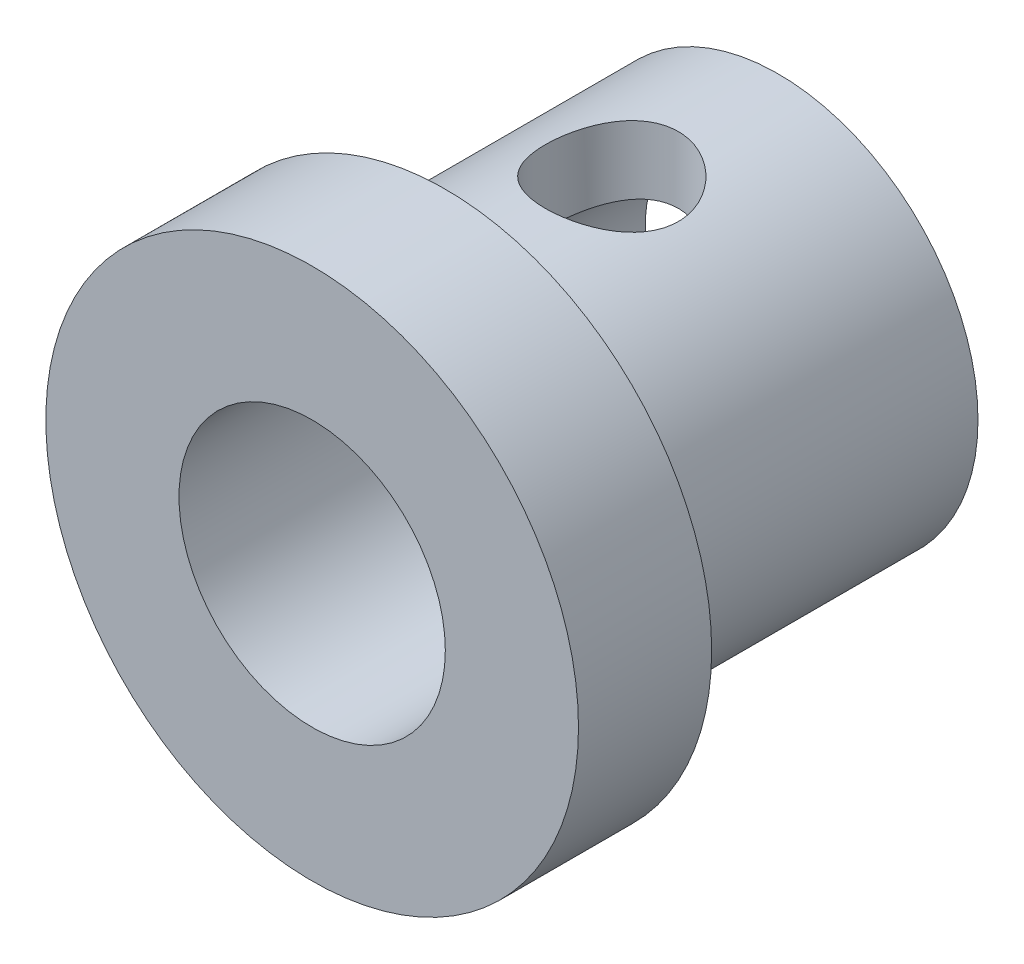
ISO-10303-21;
HEADER;
FILE_DESCRIPTION(('STEP AP214'),'2;1');
FILE_NAME('part.step','',(''),(''),'','','');
FILE_SCHEMA(('AUTOMOTIVE_DESIGN { 1 0 10303 214 1 1 1 1 }'));
ENDSEC;
DATA;
#1=APPLICATION_CONTEXT('core data for automotive mechanical design processes');
#2=APPLICATION_PROTOCOL_DEFINITION('international standard','automotive_design',2000,#1);
#3=PRODUCT_CONTEXT('',#1,'mechanical');
#4=PRODUCT('Part','Part','',(#3));
#5=PRODUCT_RELATED_PRODUCT_CATEGORY('part','',(#4));
#6=PRODUCT_DEFINITION_FORMATION('','',#4);
#7=PRODUCT_DEFINITION_CONTEXT('part definition',#1,'design');
#8=PRODUCT_DEFINITION('design','',#6,#7);
#9=PRODUCT_DEFINITION_SHAPE('','',#8);
#10=(LENGTH_UNIT() NAMED_UNIT(*) SI_UNIT(.MILLI.,.METRE.));
#11=(NAMED_UNIT(*) PLANE_ANGLE_UNIT() SI_UNIT($,.RADIAN.));
#12=(NAMED_UNIT(*) SI_UNIT($,.STERADIAN.) SOLID_ANGLE_UNIT());
#13=UNCERTAINTY_MEASURE_WITH_UNIT(LENGTH_MEASURE(1.E-05),#10,'distance_accuracy_value','');
#14=(GEOMETRIC_REPRESENTATION_CONTEXT(3) GLOBAL_UNCERTAINTY_ASSIGNED_CONTEXT((#13)) GLOBAL_UNIT_ASSIGNED_CONTEXT((#10,
#11,#12)) REPRESENTATION_CONTEXT('',''));
#15=CARTESIAN_POINT('',(0.,0.,0.));
#16=DIRECTION('',(0.,0.,1.));
#17=DIRECTION('',(1.,0.,0.));
#18=AXIS2_PLACEMENT_3D('',#15,#16,#17);
#19=CARTESIAN_POINT('',(0.,0.,4.57868852459016));
#20=DIRECTION('',(0.,0.,1.));
#21=DIRECTION('',(1.,0.,0.));
#22=AXIS2_PLACEMENT_3D('',#19,#20,#21);
#23=CYLINDRICAL_SURFACE('',#22,4.);
#24=CARTESIAN_POINT('',(0.,0.,0.));
#25=DIRECTION('',(0.,0.,1.));
#26=DIRECTION('',(1.,0.,0.));
#27=AXIS2_PLACEMENT_3D('',#24,#25,#26);
#28=CIRCLE('',#27,4.);
#29=CARTESIAN_POINT('',(4.,0.,0.));
#30=VERTEX_POINT('',#29);
#31=EDGE_CURVE('E10',#30,#30,#28,.T.);
#32=ORIENTED_EDGE('',*,*,#31,.F.);
#33=EDGE_LOOP('',(#32));
#34=FACE_BOUND('',#33,.T.);
#35=CARTESIAN_POINT('',(0.,0.,-2.));
#36=DIRECTION('',(0.,0.,1.));
#37=DIRECTION('',(1.,0.,0.));
#38=AXIS2_PLACEMENT_3D('',#35,#36,#37);
#39=CIRCLE('',#38,4.);
#40=CARTESIAN_POINT('',(4.,0.,-2.));
#41=VERTEX_POINT('',#40);
#42=EDGE_CURVE('E107',#41,#41,#39,.T.);
#43=ORIENTED_EDGE('',*,*,#42,.T.);
#44=EDGE_LOOP('',(#43));
#45=FACE_BOUND('',#44,.T.);
#46=ADVANCED_FACE('F36',(#34,#45),#23,.T.);
#47=CARTESIAN_POINT('',(0.,4.,0.));
#48=DIRECTION('',(0.,0.,-1.));
#49=DIRECTION('',(-1.,0.,0.));
#50=AXIS2_PLACEMENT_3D('',#47,#48,#49);
#51=PLANE('',#50);
#52=CARTESIAN_POINT('',(0.,0.,0.));
#53=DIRECTION('',(0.,0.,1.));
#54=DIRECTION('',(1.,0.,0.));
#55=AXIS2_PLACEMENT_3D('',#52,#53,#54);
#56=CIRCLE('',#55,2.);
#57=CARTESIAN_POINT('',(2.,0.,0.));
#58=VERTEX_POINT('',#57);
#59=EDGE_CURVE('E48',#58,#58,#56,.T.);
#60=ORIENTED_EDGE('',*,*,#59,.F.);
#61=EDGE_LOOP('',(#60));
#62=FACE_BOUND('',#61,.T.);
#63=ORIENTED_EDGE('',*,*,#31,.T.);
#64=EDGE_LOOP('',(#63));
#65=FACE_BOUND('',#64,.T.);
#66=ADVANCED_FACE('F91',(#62,#65),#51,.F.);
#67=CARTESIAN_POINT('',(0.,0.,4.57868852459016));
#68=DIRECTION('',(0.,0.,1.));
#69=DIRECTION('',(1.,0.,0.));
#70=AXIS2_PLACEMENT_3D('',#67,#68,#69);
#71=CYLINDRICAL_SURFACE('',#70,2.);
#72=CARTESIAN_POINT('',(0.,-2.,-3.5));
#73=CARTESIAN_POINT('',(-0.0525719629529865,-1.99999713404151,-3.5000033023195));
#74=CARTESIAN_POINT('',(-0.105206599698033,-1.99790491019518,-3.50417007312168));
#75=CARTESIAN_POINT('',(-0.208920235268425,-1.98974156037396,-3.52065288034092));
#76=CARTESIAN_POINT('',(-0.259996086713504,-1.98366287828984,-3.53298439299765));
#77=CARTESIAN_POINT('',(-0.358933544880574,-1.96816279403312,-3.5651938086168));
#78=CARTESIAN_POINT('',(-0.40680680293918,-1.9587543917752,-3.58504238424801));
#79=CARTESIAN_POINT('',(-0.498472616806565,-1.93745776515779,-3.63157062136494));
#80=CARTESIAN_POINT('',(-0.54226549399005,-1.9255697363353,-3.65824974424885));
#81=CARTESIAN_POINT('',(-0.627507817761919,-1.89956258258057,-3.7195172494853));
#82=CARTESIAN_POINT('',(-0.668655211122112,-1.88535199127536,-3.75448647923964));
#83=CARTESIAN_POINT('',(-0.744779444866977,-1.85659970246744,-3.83052147924703));
#84=CARTESIAN_POINT('',(-0.779751583106767,-1.84205776209035,-3.87159185177244));
#85=CARTESIAN_POINT('',(-0.845252000450278,-1.81298951197347,-3.96248334952338));
#86=CARTESIAN_POINT('',(-0.875225335551637,-1.79855186970132,-4.01273609834591));
#87=CARTESIAN_POINT('',(-0.926168226890695,-1.77285978772321,-4.11836733598621));
#88=CARTESIAN_POINT('',(-0.947144214966333,-1.7616030760699,-4.17374212872275));
#89=CARTESIAN_POINT('',(-0.978132442188588,-1.74457867037809,-4.28466510542192));
#90=CARTESIAN_POINT('',(-0.988725857080441,-1.73852271583714,-4.34000445206739));
#91=CARTESIAN_POINT('',(-1.00042699330885,-1.73181889948528,-4.45197883777948));
#92=CARTESIAN_POINT('',(-1.00154408837307,-1.73116569343288,-4.50861254087116));
#93=CARTESIAN_POINT('',(-0.994687287172294,-1.73510930257248,-4.61428602431537));
#94=CARTESIAN_POINT('',(-0.987784559536821,-1.73908763662014,-4.66342403122305));
#95=CARTESIAN_POINT('',(-0.966939849056932,-1.7507622873385,-4.75972190937304));
#96=CARTESIAN_POINT('',(-0.952995623897651,-1.75845978831776,-4.80688114530532));
#97=CARTESIAN_POINT('',(-0.918209780386004,-1.77687476412741,-4.89922913256566));
#98=CARTESIAN_POINT('',(-0.897215067115995,-1.78765840663999,-4.94434639878579));
#99=CARTESIAN_POINT('',(-0.849041687668002,-1.81103404281404,-5.03063429259001));
#100=CARTESIAN_POINT('',(-0.821860243812467,-1.82362684780191,-5.07180313560009));
#101=CARTESIAN_POINT('',(-0.758066054912788,-1.85113157903286,-5.15452125274323));
#102=CARTESIAN_POINT('',(-0.720694458369282,-1.86613510236746,-5.19545687357616));
#103=CARTESIAN_POINT('',(-0.639555578741374,-1.89547623300407,-5.2707354185909));
#104=CARTESIAN_POINT('',(-0.595785256574285,-1.90981351958801,-5.30507519203388));
#105=CARTESIAN_POINT('',(-0.500516505831848,-1.93701987282964,-5.36768566102973));
#106=CARTESIAN_POINT('',(-0.448753591599409,-1.94978984162007,-5.39560047244574));
#107=CARTESIAN_POINT('',(-0.340466215488797,-1.97157881121242,-5.44209702904301));
#108=CARTESIAN_POINT('',(-0.283945576265277,-1.98060078943553,-5.46068618501517));
#109=CARTESIAN_POINT('',(-0.172766491660702,-1.99324333741436,-5.48647540371668));
#110=CARTESIAN_POINT('',(-0.118341530548325,-1.99724938301312,-5.49449123574678));
#111=CARTESIAN_POINT('',(-0.00877959994935417,-2.00073013459102,-5.50146473113449));
#112=CARTESIAN_POINT('',(0.0463570198699009,-2.00020698721312,-5.50042668563948));
#113=CARTESIAN_POINT('',(0.151232971985993,-1.99491192253441,-5.48979331158125));
#114=CARTESIAN_POINT('',(0.201059408049954,-1.9904724568819,-5.48086746726997));
#115=CARTESIAN_POINT('',(0.298406892301917,-1.97822171314819,-5.45576192810491));
#116=CARTESIAN_POINT('',(0.345927685690996,-1.97041006334332,-5.43958143354664));
#117=CARTESIAN_POINT('',(0.438888608449665,-1.95184251413669,-5.40000153356683));
#118=CARTESIAN_POINT('',(0.484230397006154,-1.94100881769939,-5.37640894988319));
#119=CARTESIAN_POINT('',(0.570461361698921,-1.91743974317109,-5.32289246435396));
#120=CARTESIAN_POINT('',(0.611348629775282,-1.90470355565785,-5.29296586540657));
#121=CARTESIAN_POINT('',(0.691767689290652,-1.87708221337464,-5.22423957466713));
#122=CARTESIAN_POINT('',(0.730772077824638,-1.86210884848441,-5.18485713154644));
#123=CARTESIAN_POINT('',(0.801856321113239,-1.83262391603874,-5.1000748487307));
#124=CARTESIAN_POINT('',(0.833931385690841,-1.81811267381526,-5.05467088118363));
#125=CARTESIAN_POINT('',(0.891707914497696,-1.79051192226068,-4.95635634579969));
#126=CARTESIAN_POINT('',(0.917025495878637,-1.77752529663472,-4.90318873379141));
#127=CARTESIAN_POINT('',(0.958082826013803,-1.75574072368126,-4.79248993230748));
#128=CARTESIAN_POINT('',(0.97383491588757,-1.74693738240618,-4.73496447349881));
#129=CARTESIAN_POINT('',(0.993861687449679,-1.73561501008667,-4.62308977713855));
#130=CARTESIAN_POINT('',(0.999092996400865,-1.73257383460491,-4.56896574657097));
#131=CARTESIAN_POINT('',(1.00068915438079,-1.73165354646175,-4.46055293282927));
#132=CARTESIAN_POINT('',(0.997057846624399,-1.73377219627553,-4.40626423126057));
#133=CARTESIAN_POINT('',(0.981926125592263,-1.74237862050025,-4.30451649846799));
#134=CARTESIAN_POINT('',(0.9712083143428,-1.74843094482394,-4.2568995298556));
#135=CARTESIAN_POINT('',(0.943175358224645,-1.76371016187918,-4.16419188057529));
#136=CARTESIAN_POINT('',(0.92585809115981,-1.77293807569676,-4.11910201790803));
#137=CARTESIAN_POINT('',(0.883815745300683,-1.79428530364528,-4.02937514901339));
#138=CARTESIAN_POINT('',(0.858671137816458,-1.80655722396191,-3.9849720981703));
#139=CARTESIAN_POINT('',(0.802150971636634,-1.8323533163459,-3.90072546381941));
#140=CARTESIAN_POINT('',(0.770772171238648,-1.84587813794522,-3.86088426948151));
#141=CARTESIAN_POINT('',(0.698203326664641,-1.87462323159313,-3.78185801764239));
#142=CARTESIAN_POINT('',(0.656284423010171,-1.88984983311469,-3.74334089763808));
#143=CARTESIAN_POINT('',(0.56615480622028,-1.91877752255088,-3.67373701657637));
#144=CARTESIAN_POINT('',(0.517940723256785,-1.9324777860804,-3.64265426057371));
#145=CARTESIAN_POINT('',(0.415931596819947,-1.95698009585103,-3.5887636372378));
#146=CARTESIAN_POINT('',(0.362099503934614,-1.96776096562909,-3.56601583058857));
#147=CARTESIAN_POINT('',(0.250742101294191,-1.98501341363465,-3.53019183208105));
#148=CARTESIAN_POINT('',(0.193227799623166,-1.99149723372932,-3.51708815317042));
#149=CARTESIAN_POINT('',(0.112601946483384,-1.99695461909663,-3.50610258892415));
#150=CARTESIAN_POINT('',(0.090161879439499,-1.99809365339202,-3.50381735913638));
#151=CARTESIAN_POINT('',(0.0451517318071578,-1.99961696977865,-3.50076533448319));
#152=CARTESIAN_POINT('',(0.0225816476473815,-2.00000123103763,-3.4999985815288));
#153=CARTESIAN_POINT('',(0.,-2.,-3.5));
#154=B_SPLINE_CURVE_WITH_KNOTS('',3,(#72,#73,#74,#75,#76,#77,#78,#79,#80,#81,#82,#83,#84,#85,
#86,#87,#88,#89,#90,#91,#92,#93,#94,#95,#96,#97,#98,#99,#100,#101,#102,#103,#104,#105,#106,#107,
#108,#109,#110,#111,#112,#113,#114,#115,#116,#117,#118,#119,#120,#121,#122,#123,#124,#125,#126,
#127,#128,#129,#130,#131,#132,#133,#134,#135,#136,#137,#138,#139,#140,#141,#142,#143,#144,#145,
#146,#147,#148,#149,#150,#151,#152,#153),.UNSPECIFIED.,.T.,.F.,(4,2,2,2,2,2,2,2,2,2,2,2,2,2,2,2,
2,2,2,2,2,2,2,2,2,2,2,2,2,2,2,2,2,2,2,2,2,2,2,2,4),(0.,0.157624257420292,0.315548149709198,
0.472862155492298,0.630163760581568,0.796981758718089,0.963926237654035,1.14381726430753,
1.32357947898281,1.49258012140229,1.6614135732902,1.81005712409321,1.95874803925678,
2.11090240168487,2.26312521260222,2.43464941333878,2.60625534598686,2.78583022214441,
2.96526216912279,3.12983290471346,3.29432564511476,3.44606906506122,3.59782921630931,
3.75392856027899,3.91009450748339,4.08159610644419,4.25321588615432,4.43314682159674,
4.61284511940778,4.77529307498373,4.93767059860005,5.08457930244183,5.23153528783678,
5.38836456775614,5.54527561138958,5.72125242752498,5.89732383376572,6.07464013662925,
6.2514490862493,6.31915280137697,6.38685838514847),.UNSPECIFIED.);
#155=CARTESIAN_POINT('',(0.,-2.,-3.5));
#156=VERTEX_POINT('',#155);
#157=EDGE_CURVE('E82',#156,#156,#154,.T.);
#158=ORIENTED_EDGE('',*,*,#157,.T.);
#159=EDGE_LOOP('',(#158));
#160=FACE_BOUND('',#159,.T.);
#161=CARTESIAN_POINT('',(0.,2.,-3.5));
#162=CARTESIAN_POINT('',(0.0525719629529865,1.99999713404151,-3.5000033023195));
#163=CARTESIAN_POINT('',(0.105206599698033,1.99790491019518,-3.50417007312168));
#164=CARTESIAN_POINT('',(0.208920235268425,1.98974156037396,-3.52065288034092));
#165=CARTESIAN_POINT('',(0.259996086713504,1.98366287828984,-3.53298439299765));
#166=CARTESIAN_POINT('',(0.358933544880574,1.96816279403312,-3.5651938086168));
#167=CARTESIAN_POINT('',(0.40680680293918,1.9587543917752,-3.58504238424801));
#168=CARTESIAN_POINT('',(0.498472616806565,1.93745776515779,-3.63157062136494));
#169=CARTESIAN_POINT('',(0.54226549399005,1.9255697363353,-3.65824974424885));
#170=CARTESIAN_POINT('',(0.627507817761919,1.89956258258057,-3.7195172494853));
#171=CARTESIAN_POINT('',(0.668655211122112,1.88535199127536,-3.75448647923964));
#172=CARTESIAN_POINT('',(0.744779444866977,1.85659970246744,-3.83052147924703));
#173=CARTESIAN_POINT('',(0.779751583106767,1.84205776209035,-3.87159185177244));
#174=CARTESIAN_POINT('',(0.845252000450278,1.81298951197347,-3.96248334952338));
#175=CARTESIAN_POINT('',(0.875225335551637,1.79855186970132,-4.01273609834591));
#176=CARTESIAN_POINT('',(0.926168226890695,1.77285978772321,-4.11836733598621));
#177=CARTESIAN_POINT('',(0.947144214966333,1.7616030760699,-4.17374212872275));
#178=CARTESIAN_POINT('',(0.978132442188588,1.74457867037809,-4.28466510542192));
#179=CARTESIAN_POINT('',(0.988725857080441,1.73852271583714,-4.34000445206739));
#180=CARTESIAN_POINT('',(1.00042699330885,1.73181889948528,-4.45197883777948));
#181=CARTESIAN_POINT('',(1.00154408837307,1.73116569343288,-4.50861254087116));
#182=CARTESIAN_POINT('',(0.994687287172294,1.73510930257248,-4.61428602431537));
#183=CARTESIAN_POINT('',(0.987784559536821,1.73908763662014,-4.66342403122305));
#184=CARTESIAN_POINT('',(0.966939849056932,1.7507622873385,-4.75972190937304));
#185=CARTESIAN_POINT('',(0.952995623897651,1.75845978831776,-4.80688114530532));
#186=CARTESIAN_POINT('',(0.918209780386004,1.77687476412741,-4.89922913256566));
#187=CARTESIAN_POINT('',(0.897215067115995,1.78765840663999,-4.94434639878579));
#188=CARTESIAN_POINT('',(0.849041687668002,1.81103404281404,-5.03063429259001));
#189=CARTESIAN_POINT('',(0.821860243812467,1.82362684780191,-5.07180313560009));
#190=CARTESIAN_POINT('',(0.758066054912788,1.85113157903286,-5.15452125274323));
#191=CARTESIAN_POINT('',(0.720694458369282,1.86613510236746,-5.19545687357616));
#192=CARTESIAN_POINT('',(0.639555578741374,1.89547623300407,-5.2707354185909));
#193=CARTESIAN_POINT('',(0.595785256574285,1.90981351958801,-5.30507519203388));
#194=CARTESIAN_POINT('',(0.500516505831848,1.93701987282964,-5.36768566102973));
#195=CARTESIAN_POINT('',(0.448753591599409,1.94978984162007,-5.39560047244574));
#196=CARTESIAN_POINT('',(0.340466215488797,1.97157881121242,-5.44209702904301));
#197=CARTESIAN_POINT('',(0.283945576265277,1.98060078943553,-5.46068618501517));
#198=CARTESIAN_POINT('',(0.172766491660702,1.99324333741436,-5.48647540371668));
#199=CARTESIAN_POINT('',(0.118341530548325,1.99724938301312,-5.49449123574678));
#200=CARTESIAN_POINT('',(0.00877959994935417,2.00073013459102,-5.50146473113449));
#201=CARTESIAN_POINT('',(-0.0463570198699009,2.00020698721312,-5.50042668563948));
#202=CARTESIAN_POINT('',(-0.151232971985993,1.99491192253441,-5.48979331158125));
#203=CARTESIAN_POINT('',(-0.201059408049954,1.9904724568819,-5.48086746726997));
#204=CARTESIAN_POINT('',(-0.298406892301917,1.97822171314819,-5.45576192810491));
#205=CARTESIAN_POINT('',(-0.345927685690996,1.97041006334332,-5.43958143354664));
#206=CARTESIAN_POINT('',(-0.438888608449665,1.95184251413669,-5.40000153356683));
#207=CARTESIAN_POINT('',(-0.484230397006154,1.94100881769939,-5.37640894988319));
#208=CARTESIAN_POINT('',(-0.570461361698921,1.91743974317109,-5.32289246435396));
#209=CARTESIAN_POINT('',(-0.611348629775282,1.90470355565785,-5.29296586540657));
#210=CARTESIAN_POINT('',(-0.691767689290652,1.87708221337464,-5.22423957466713));
#211=CARTESIAN_POINT('',(-0.730772077824638,1.86210884848441,-5.18485713154644));
#212=CARTESIAN_POINT('',(-0.801856321113239,1.83262391603874,-5.1000748487307));
#213=CARTESIAN_POINT('',(-0.833931385690841,1.81811267381526,-5.05467088118363));
#214=CARTESIAN_POINT('',(-0.891707914497696,1.79051192226068,-4.95635634579969));
#215=CARTESIAN_POINT('',(-0.917025495878637,1.77752529663472,-4.90318873379141));
#216=CARTESIAN_POINT('',(-0.958082826013803,1.75574072368126,-4.79248993230748));
#217=CARTESIAN_POINT('',(-0.97383491588757,1.74693738240618,-4.73496447349881));
#218=CARTESIAN_POINT('',(-0.993861687449679,1.73561501008667,-4.62308977713855));
#219=CARTESIAN_POINT('',(-0.999092996400865,1.73257383460491,-4.56896574657097));
#220=CARTESIAN_POINT('',(-1.00068915438079,1.73165354646175,-4.46055293282927));
#221=CARTESIAN_POINT('',(-0.997057846624399,1.73377219627553,-4.40626423126057));
#222=CARTESIAN_POINT('',(-0.981926125592263,1.74237862050025,-4.30451649846799));
#223=CARTESIAN_POINT('',(-0.9712083143428,1.74843094482394,-4.2568995298556));
#224=CARTESIAN_POINT('',(-0.943175358224645,1.76371016187918,-4.16419188057529));
#225=CARTESIAN_POINT('',(-0.92585809115981,1.77293807569676,-4.11910201790803));
#226=CARTESIAN_POINT('',(-0.883815745300683,1.79428530364528,-4.02937514901339));
#227=CARTESIAN_POINT('',(-0.858671137816458,1.80655722396191,-3.9849720981703));
#228=CARTESIAN_POINT('',(-0.802150971636634,1.8323533163459,-3.90072546381941));
#229=CARTESIAN_POINT('',(-0.770772171238648,1.84587813794522,-3.86088426948151));
#230=CARTESIAN_POINT('',(-0.698203326664641,1.87462323159313,-3.78185801764239));
#231=CARTESIAN_POINT('',(-0.656284423010171,1.88984983311469,-3.74334089763808));
#232=CARTESIAN_POINT('',(-0.56615480622028,1.91877752255088,-3.67373701657637));
#233=CARTESIAN_POINT('',(-0.517940723256785,1.9324777860804,-3.64265426057371));
#234=CARTESIAN_POINT('',(-0.415931596819947,1.95698009585103,-3.5887636372378));
#235=CARTESIAN_POINT('',(-0.362099503934614,1.96776096562909,-3.56601583058857));
#236=CARTESIAN_POINT('',(-0.250742101294191,1.98501341363465,-3.53019183208105));
#237=CARTESIAN_POINT('',(-0.193227799623166,1.99149723372932,-3.51708815317042));
#238=CARTESIAN_POINT('',(-0.112601946483384,1.99695461909663,-3.50610258892415));
#239=CARTESIAN_POINT('',(-0.090161879439499,1.99809365339202,-3.50381735913638));
#240=CARTESIAN_POINT('',(-0.0451517318071578,1.99961696977865,-3.50076533448319));
#241=CARTESIAN_POINT('',(-0.0225816476473815,2.00000123103763,-3.4999985815288));
#242=CARTESIAN_POINT('',(0.,2.,-3.5));
#243=B_SPLINE_CURVE_WITH_KNOTS('',3,(#161,#162,#163,#164,#165,#166,#167,#168,#169,#170,#171,
#172,#173,#174,#175,#176,#177,#178,#179,#180,#181,#182,#183,#184,#185,#186,#187,#188,#189,#190,
#191,#192,#193,#194,#195,#196,#197,#198,#199,#200,#201,#202,#203,#204,#205,#206,#207,#208,#209,
#210,#211,#212,#213,#214,#215,#216,#217,#218,#219,#220,#221,#222,#223,#224,#225,#226,#227,#228,
#229,#230,#231,#232,#233,#234,#235,#236,#237,#238,#239,#240,#241,#242),.UNSPECIFIED.,.T.,.F.,(4,
2,2,2,2,2,2,2,2,2,2,2,2,2,2,2,2,2,2,2,2,2,2,2,2,2,2,2,2,2,2,2,2,2,2,2,2,2,2,2,4),(0.,
0.157624257420292,0.315548149709198,0.472862155492298,0.630163760581568,0.796981758718089,
0.963926237654035,1.14381726430753,1.32357947898281,1.49258012140229,1.6614135732902,
1.81005712409321,1.95874803925678,2.11090240168487,2.26312521260222,2.43464941333878,
2.60625534598686,2.78583022214441,2.96526216912279,3.12983290471346,3.29432564511476,
3.44606906506122,3.59782921630931,3.75392856027899,3.91009450748339,4.08159610644419,
4.25321588615432,4.43314682159674,4.61284511940778,4.77529307498373,4.93767059860005,
5.08457930244183,5.23153528783678,5.38836456775614,5.54527561138958,5.72125242752498,
5.89732383376572,6.07464013662925,6.2514490862493,6.31915280137697,6.38685838514847),.UNSPECIFIED.);
#244=CARTESIAN_POINT('',(0.,2.,-3.5));
#245=VERTEX_POINT('',#244);
#246=EDGE_CURVE('E76',#245,#245,#243,.T.);
#247=ORIENTED_EDGE('',*,*,#246,.T.);
#248=EDGE_LOOP('',(#247));
#249=FACE_BOUND('',#248,.T.);
#250=CARTESIAN_POINT('',(0.,0.,-7.));
#251=DIRECTION('',(0.,0.,1.));
#252=DIRECTION('',(1.,0.,0.));
#253=AXIS2_PLACEMENT_3D('',#250,#251,#252);
#254=CIRCLE('',#253,2.);
#255=CARTESIAN_POINT('',(2.,0.,-7.));
#256=VERTEX_POINT('',#255);
#257=EDGE_CURVE('E53',#256,#256,#254,.T.);
#258=ORIENTED_EDGE('',*,*,#257,.F.);
#259=EDGE_LOOP('',(#258));
#260=FACE_BOUND('',#259,.T.);
#261=ORIENTED_EDGE('',*,*,#59,.T.);
#262=EDGE_LOOP('',(#261));
#263=FACE_BOUND('',#262,.T.);
#264=ADVANCED_FACE('F87',(#160,#249,#260,#263),#71,.F.);
#265=CARTESIAN_POINT('',(0.,2.,-7.));
#266=DIRECTION('',(0.,0.,1.));
#267=DIRECTION('',(1.,0.,0.));
#268=AXIS2_PLACEMENT_3D('',#265,#266,#267);
#269=PLANE('',#268);
#270=CARTESIAN_POINT('',(0.,0.,-7.));
#271=DIRECTION('',(0.,0.,1.));
#272=DIRECTION('',(1.,0.,0.));
#273=AXIS2_PLACEMENT_3D('',#270,#271,#272);
#274=CIRCLE('',#273,3.);
#275=CARTESIAN_POINT('',(3.,0.,-7.));
#276=VERTEX_POINT('',#275);
#277=EDGE_CURVE('E111',#276,#276,#274,.T.);
#278=ORIENTED_EDGE('',*,*,#277,.F.);
#279=EDGE_LOOP('',(#278));
#280=FACE_BOUND('',#279,.T.);
#281=ORIENTED_EDGE('',*,*,#257,.T.);
#282=EDGE_LOOP('',(#281));
#283=FACE_BOUND('',#282,.T.);
#284=ADVANCED_FACE('F90',(#280,#283),#269,.F.);
#285=CARTESIAN_POINT('',(0.,0.,4.57868852459016));
#286=DIRECTION('',(0.,0.,1.));
#287=DIRECTION('',(1.,0.,0.));
#288=AXIS2_PLACEMENT_3D('',#285,#286,#287);
#289=CYLINDRICAL_SURFACE('',#288,3.);
#290=CARTESIAN_POINT('',(0.,-3.,-3.5));
#291=CARTESIAN_POINT('',(0.0545633628867232,-3.00000015300943,-3.49999974626836));
#292=CARTESIAN_POINT('',(0.10912519453855,-2.99849769507545,-3.50448026612722));
#293=CARTESIAN_POINT('',(0.216641760872972,-2.99265210203281,-3.52222910881722));
#294=CARTESIAN_POINT('',(0.269596328118818,-2.98830867202153,-3.53549834394892));
#295=CARTESIAN_POINT('',(0.372332789501776,-2.97725307906443,-3.57031924338405));
#296=CARTESIAN_POINT('',(0.422119825886034,-2.97054487730853,-3.59185706245927));
#297=CARTESIAN_POINT('',(0.517374936805324,-2.95544445717342,-3.64254117283835));
#298=CARTESIAN_POINT('',(0.562842156958705,-2.94705190667778,-3.6716889650026));
#299=CARTESIAN_POINT('',(0.649741675022266,-2.92914094443005,-3.73782580485875));
#300=CARTESIAN_POINT('',(0.691003700298309,-2.91959556463785,-3.77503123426049));
#301=CARTESIAN_POINT('',(0.766832692702084,-2.90060314783121,-3.85576715470657));
#302=CARTESIAN_POINT('',(0.801398185489462,-2.89115613290549,-3.89929903492851));
#303=CARTESIAN_POINT('',(0.863824942227859,-2.87313332477274,-3.99298511519646));
#304=CARTESIAN_POINT('',(0.891464858221032,-2.86459039275688,-4.04329373973212));
#305=CARTESIAN_POINT('',(0.937818873877721,-2.84975305418601,-4.14817609445855));
#306=CARTESIAN_POINT('',(0.956535697386765,-2.84345796160746,-4.20274851716274));
#307=CARTESIAN_POINT('',(0.983873461509163,-2.83411303269377,-4.31267322149671));
#308=CARTESIAN_POINT('',(0.992813448271769,-2.83096095769611,-4.36793720848907));
#309=CARTESIAN_POINT('',(1.00134112333448,-2.82795656629508,-4.47926375415588));
#310=CARTESIAN_POINT('',(1.00093170160472,-2.8281032302273,-4.53532606070919));
#311=CARTESIAN_POINT('',(0.991019903703419,-2.8315901500818,-4.64393663044402));
#312=CARTESIAN_POINT('',(0.981933913166995,-2.83478415867533,-4.69652840291902));
#313=CARTESIAN_POINT('',(0.955606162849417,-2.84376657724551,-4.79939341960683));
#314=CARTESIAN_POINT('',(0.938363426591871,-2.84955529784108,-4.84966638543507));
#315=CARTESIAN_POINT('',(0.895939058060211,-2.86317911131249,-4.94741274959148));
#316=CARTESIAN_POINT('',(0.870634048707263,-2.87104565793117,-4.99482802546953));
#317=CARTESIAN_POINT('',(0.812889106303139,-2.88792558575726,-5.08487090827973));
#318=CARTESIAN_POINT('',(0.780447112364006,-2.89693929790464,-5.12749712693338));
#319=CARTESIAN_POINT('',(0.707349332682238,-2.91567329167741,-5.20909159816077));
#320=CARTESIAN_POINT('',(0.666353150076311,-2.92540589354843,-5.24775269450907));
#321=CARTESIAN_POINT('',(0.578339569970064,-2.94406938387037,-5.3177312666634));
#322=CARTESIAN_POINT('',(0.531321595660815,-2.95300019538067,-5.3490480381645));
#323=CARTESIAN_POINT('',(0.431947613046268,-2.96917107937794,-5.40369630023507));
#324=CARTESIAN_POINT('',(0.379543276416337,-2.97639350008039,-5.42694549134073));
#325=CARTESIAN_POINT('',(0.271269083364508,-2.98820567144435,-5.46420317395571));
#326=CARTESIAN_POINT('',(0.215400438154954,-2.99279633654878,-5.47821487542344));
#327=CARTESIAN_POINT('',(0.104383829529304,-2.99867627071441,-5.49605566602236));
#328=CARTESIAN_POINT('',(0.0493095998648452,-3.00010001833731,-5.50029980917275));
#329=CARTESIAN_POINT('',(-0.0607750699602365,-2.99988902694825,-5.49966732640153));
#330=CARTESIAN_POINT('',(-0.115785519319647,-2.99825480419352,-5.49479224002013));
#331=CARTESIAN_POINT('',(-0.222519866304259,-2.99220024717114,-5.47638809226403));
#332=CARTESIAN_POINT('',(-0.274292806834856,-2.98786198711228,-5.46311379395048));
#333=CARTESIAN_POINT('',(-0.374855958579561,-2.97691846830034,-5.4286065555333));
#334=CARTESIAN_POINT('',(-0.423645788508559,-2.97031292046541,-5.40737260053233));
#335=CARTESIAN_POINT('',(-0.518288296393321,-2.95528931287427,-5.3569295681591));
#336=CARTESIAN_POINT('',(-0.564029959217329,-2.94682814756305,-5.3275254067164));
#337=CARTESIAN_POINT('',(-0.650064830135403,-2.92905253915743,-5.26180584998695));
#338=CARTESIAN_POINT('',(-0.690356367794893,-2.91973783591888,-5.22548834396984));
#339=CARTESIAN_POINT('',(-0.766252507807013,-2.90076847982472,-5.14502124899174));
#340=CARTESIAN_POINT('',(-0.801560969248491,-2.89111761095155,-5.10059077306675));
#341=CARTESIAN_POINT('',(-0.864257522320854,-2.87299973286981,-5.0062284321955));
#342=CARTESIAN_POINT('',(-0.891645547920843,-2.8645327335312,-4.9562965213898));
#343=CARTESIAN_POINT('',(-0.937596930423361,-2.84982391820308,-4.85232698469341));
#344=CARTESIAN_POINT('',(-0.956178132197766,-2.84357760900632,-4.79829792075722));
#345=CARTESIAN_POINT('',(-0.983894666792163,-2.83410832399133,-4.68762134987585));
#346=CARTESIAN_POINT('',(-0.993034254961244,-2.83088398622698,-4.63097503456694));
#347=CARTESIAN_POINT('',(-1.00127628247038,-2.82797858875071,-4.51980290398679));
#348=CARTESIAN_POINT('',(-1.00087025731093,-2.82812400344299,-4.46531765974826));
#349=CARTESIAN_POINT('',(-0.991242293454878,-2.8315126992356,-4.35723492510026));
#350=CARTESIAN_POINT('',(-0.982020879458887,-2.83475579595884,-4.30363738204709));
#351=CARTESIAN_POINT('',(-0.95537181312698,-2.84384524278943,-4.19986433698733));
#352=CARTESIAN_POINT('',(-0.93810334601488,-2.84964098015514,-4.14964317499277));
#353=CARTESIAN_POINT('',(-0.895979365760382,-2.86316398825434,-4.05277259306447));
#354=CARTESIAN_POINT('',(-0.871122168553979,-2.87089168765297,-4.00612396881274));
#355=CARTESIAN_POINT('',(-0.813260692583249,-2.8878282922406,-3.91551633007631));
#356=CARTESIAN_POINT('',(-0.779948242764532,-2.89708711641604,-3.87176349810141));
#357=CARTESIAN_POINT('',(-0.706642883135697,-2.91583356283786,-3.79031018661601));
#358=CARTESIAN_POINT('',(-0.666648084451495,-2.92532124912518,-3.75261142431198));
#359=CARTESIAN_POINT('',(-0.579241556920674,-2.94390030525393,-3.68285558771076));
#360=CARTESIAN_POINT('',(-0.531601513499725,-2.95296181801216,-3.65107565224899));
#361=CARTESIAN_POINT('',(-0.431357357406628,-2.96925991172652,-3.59600957114937));
#362=CARTESIAN_POINT('',(-0.37875451813235,-2.9764969590794,-3.57272125407796));
#363=CARTESIAN_POINT('',(-0.272493647200975,-2.98805515068532,-3.53627836751132));
#364=CARTESIAN_POINT('',(-0.218987757676409,-2.9924921242252,-3.52271753373662));
#365=CARTESIAN_POINT('',(-0.110320416010247,-2.99846407064225,-3.50457971932288));
#366=CARTESIAN_POINT('',(-0.0551594255687466,-2.99999984531906,-3.50000025650346));
#367=CARTESIAN_POINT('',(0.,-3.,-3.5));
#368=B_SPLINE_CURVE_WITH_KNOTS('',3,(#290,#291,#292,#293,#294,#295,#296,#297,#298,#299,#300,
#301,#302,#303,#304,#305,#306,#307,#308,#309,#310,#311,#312,#313,#314,#315,#316,#317,#318,#319,
#320,#321,#322,#323,#324,#325,#326,#327,#328,#329,#330,#331,#332,#333,#334,#335,#336,#337,#338,
#339,#340,#341,#342,#343,#344,#345,#346,#347,#348,#349,#350,#351,#352,#353,#354,#355,#356,#357,
#358,#359,#360,#361,#362,#363,#364,#365,#366,#367),.UNSPECIFIED.,.T.,.F.,(4,2,2,2,2,2,2,2,2,2,2,
2,2,2,2,2,2,2,2,2,2,2,2,2,2,2,2,2,2,2,2,2,2,2,2,2,2,2,4),(0.,0.163487106026011,
0.326991185267521,0.490222672870273,0.6534863777991,0.82184684282756,0.990244332875302,
1.1634838482347,1.33667044692833,1.5040192574184,1.67131633987485,1.8309682655128,
1.99063930855482,2.1528817115513,2.31517102558207,2.48593305811367,2.65671145966618,
2.82918405650357,3.00159668877208,3.1665358317517,3.33144713164176,3.49158157978213,
3.65173645284104,3.81610399843736,3.98052180821891,4.15241022880752,4.32430008234997,
4.49584013824416,4.66730284700846,4.82995666056619,4.99260079341185,5.15215587070227,
5.31174638165787,5.47830066681615,5.64490211113589,5.8179966082491,5.99104681142266,
6.15636558363623,6.3216386602795),.UNSPECIFIED.);
#369=CARTESIAN_POINT('',(0.,-3.,-3.5));
#370=VERTEX_POINT('',#369);
#371=EDGE_CURVE('E39',#370,#370,#368,.T.);
#372=ORIENTED_EDGE('',*,*,#371,.T.);
#373=EDGE_LOOP('',(#372));
#374=FACE_BOUND('',#373,.T.);
#375=CARTESIAN_POINT('',(0.,3.,-3.5));
#376=CARTESIAN_POINT('',(-0.0545633628867232,3.00000015300943,-3.49999974626836));
#377=CARTESIAN_POINT('',(-0.10912519453855,2.99849769507545,-3.50448026612722));
#378=CARTESIAN_POINT('',(-0.216641760872972,2.99265210203281,-3.52222910881722));
#379=CARTESIAN_POINT('',(-0.269596328118818,2.98830867202153,-3.53549834394892));
#380=CARTESIAN_POINT('',(-0.372332789501776,2.97725307906443,-3.57031924338405));
#381=CARTESIAN_POINT('',(-0.422119825886034,2.97054487730853,-3.59185706245927));
#382=CARTESIAN_POINT('',(-0.517374936805324,2.95544445717342,-3.64254117283835));
#383=CARTESIAN_POINT('',(-0.562842156958705,2.94705190667778,-3.6716889650026));
#384=CARTESIAN_POINT('',(-0.649741675022266,2.92914094443005,-3.73782580485875));
#385=CARTESIAN_POINT('',(-0.691003700298309,2.91959556463785,-3.77503123426049));
#386=CARTESIAN_POINT('',(-0.766832692702084,2.90060314783121,-3.85576715470657));
#387=CARTESIAN_POINT('',(-0.801398185489462,2.89115613290549,-3.89929903492851));
#388=CARTESIAN_POINT('',(-0.863824942227859,2.87313332477274,-3.99298511519646));
#389=CARTESIAN_POINT('',(-0.891464858221032,2.86459039275688,-4.04329373973212));
#390=CARTESIAN_POINT('',(-0.937818873877721,2.84975305418601,-4.14817609445855));
#391=CARTESIAN_POINT('',(-0.956535697386765,2.84345796160746,-4.20274851716274));
#392=CARTESIAN_POINT('',(-0.983873461509163,2.83411303269377,-4.31267322149671));
#393=CARTESIAN_POINT('',(-0.992813448271769,2.83096095769611,-4.36793720848907));
#394=CARTESIAN_POINT('',(-1.00134112333448,2.82795656629508,-4.47926375415588));
#395=CARTESIAN_POINT('',(-1.00093170160472,2.8281032302273,-4.53532606070919));
#396=CARTESIAN_POINT('',(-0.991019903703419,2.8315901500818,-4.64393663044402));
#397=CARTESIAN_POINT('',(-0.981933913166995,2.83478415867533,-4.69652840291902));
#398=CARTESIAN_POINT('',(-0.955606162849417,2.84376657724551,-4.79939341960683));
#399=CARTESIAN_POINT('',(-0.938363426591871,2.84955529784108,-4.84966638543507));
#400=CARTESIAN_POINT('',(-0.895939058060211,2.86317911131249,-4.94741274959148));
#401=CARTESIAN_POINT('',(-0.870634048707263,2.87104565793117,-4.99482802546953));
#402=CARTESIAN_POINT('',(-0.812889106303139,2.88792558575726,-5.08487090827973));
#403=CARTESIAN_POINT('',(-0.780447112364006,2.89693929790464,-5.12749712693338));
#404=CARTESIAN_POINT('',(-0.707349332682238,2.91567329167741,-5.20909159816077));
#405=CARTESIAN_POINT('',(-0.666353150076311,2.92540589354843,-5.24775269450907));
#406=CARTESIAN_POINT('',(-0.578339569970064,2.94406938387037,-5.3177312666634));
#407=CARTESIAN_POINT('',(-0.531321595660815,2.95300019538067,-5.3490480381645));
#408=CARTESIAN_POINT('',(-0.431947613046268,2.96917107937794,-5.40369630023507));
#409=CARTESIAN_POINT('',(-0.379543276416337,2.97639350008039,-5.42694549134073));
#410=CARTESIAN_POINT('',(-0.271269083364508,2.98820567144435,-5.46420317395571));
#411=CARTESIAN_POINT('',(-0.215400438154954,2.99279633654878,-5.47821487542344));
#412=CARTESIAN_POINT('',(-0.104383829529304,2.99867627071441,-5.49605566602236));
#413=CARTESIAN_POINT('',(-0.0493095998648452,3.00010001833731,-5.50029980917275));
#414=CARTESIAN_POINT('',(0.0607750699602365,2.99988902694825,-5.49966732640153));
#415=CARTESIAN_POINT('',(0.115785519319647,2.99825480419352,-5.49479224002013));
#416=CARTESIAN_POINT('',(0.222519866304259,2.99220024717114,-5.47638809226403));
#417=CARTESIAN_POINT('',(0.274292806834856,2.98786198711228,-5.46311379395048));
#418=CARTESIAN_POINT('',(0.374855958579561,2.97691846830034,-5.4286065555333));
#419=CARTESIAN_POINT('',(0.423645788508559,2.97031292046541,-5.40737260053233));
#420=CARTESIAN_POINT('',(0.518288296393321,2.95528931287427,-5.3569295681591));
#421=CARTESIAN_POINT('',(0.564029959217329,2.94682814756305,-5.3275254067164));
#422=CARTESIAN_POINT('',(0.650064830135403,2.92905253915743,-5.26180584998695));
#423=CARTESIAN_POINT('',(0.690356367794893,2.91973783591888,-5.22548834396984));
#424=CARTESIAN_POINT('',(0.766252507807013,2.90076847982472,-5.14502124899174));
#425=CARTESIAN_POINT('',(0.801560969248491,2.89111761095155,-5.10059077306675));
#426=CARTESIAN_POINT('',(0.864257522320854,2.87299973286981,-5.0062284321955));
#427=CARTESIAN_POINT('',(0.891645547920843,2.8645327335312,-4.9562965213898));
#428=CARTESIAN_POINT('',(0.937596930423361,2.84982391820308,-4.85232698469341));
#429=CARTESIAN_POINT('',(0.956178132197766,2.84357760900632,-4.79829792075722));
#430=CARTESIAN_POINT('',(0.983894666792163,2.83410832399133,-4.68762134987585));
#431=CARTESIAN_POINT('',(0.993034254961244,2.83088398622698,-4.63097503456694));
#432=CARTESIAN_POINT('',(1.00127628247038,2.82797858875071,-4.51980290398679));
#433=CARTESIAN_POINT('',(1.00087025731093,2.82812400344299,-4.46531765974826));
#434=CARTESIAN_POINT('',(0.991242293454878,2.8315126992356,-4.35723492510026));
#435=CARTESIAN_POINT('',(0.982020879458887,2.83475579595884,-4.30363738204709));
#436=CARTESIAN_POINT('',(0.95537181312698,2.84384524278943,-4.19986433698733));
#437=CARTESIAN_POINT('',(0.93810334601488,2.84964098015514,-4.14964317499277));
#438=CARTESIAN_POINT('',(0.895979365760382,2.86316398825434,-4.05277259306447));
#439=CARTESIAN_POINT('',(0.871122168553979,2.87089168765297,-4.00612396881274));
#440=CARTESIAN_POINT('',(0.813260692583249,2.8878282922406,-3.91551633007631));
#441=CARTESIAN_POINT('',(0.779948242764532,2.89708711641604,-3.87176349810141));
#442=CARTESIAN_POINT('',(0.706642883135697,2.91583356283786,-3.79031018661601));
#443=CARTESIAN_POINT('',(0.666648084451495,2.92532124912518,-3.75261142431198));
#444=CARTESIAN_POINT('',(0.579241556920674,2.94390030525393,-3.68285558771076));
#445=CARTESIAN_POINT('',(0.531601513499725,2.95296181801216,-3.65107565224899));
#446=CARTESIAN_POINT('',(0.431357357406628,2.96925991172652,-3.59600957114937));
#447=CARTESIAN_POINT('',(0.37875451813235,2.9764969590794,-3.57272125407796));
#448=CARTESIAN_POINT('',(0.272493647200975,2.98805515068532,-3.53627836751132));
#449=CARTESIAN_POINT('',(0.218987757676409,2.9924921242252,-3.52271753373662));
#450=CARTESIAN_POINT('',(0.110320416010247,2.99846407064225,-3.50457971932288));
#451=CARTESIAN_POINT('',(0.0551594255687466,2.99999984531906,-3.50000025650346));
#452=CARTESIAN_POINT('',(0.,3.,-3.5));
#453=B_SPLINE_CURVE_WITH_KNOTS('',3,(#375,#376,#377,#378,#379,#380,#381,#382,#383,#384,#385,
#386,#387,#388,#389,#390,#391,#392,#393,#394,#395,#396,#397,#398,#399,#400,#401,#402,#403,#404,
#405,#406,#407,#408,#409,#410,#411,#412,#413,#414,#415,#416,#417,#418,#419,#420,#421,#422,#423,
#424,#425,#426,#427,#428,#429,#430,#431,#432,#433,#434,#435,#436,#437,#438,#439,#440,#441,#442,
#443,#444,#445,#446,#447,#448,#449,#450,#451,#452),.UNSPECIFIED.,.T.,.F.,(4,2,2,2,2,2,2,2,2,2,2,
2,2,2,2,2,2,2,2,2,2,2,2,2,2,2,2,2,2,2,2,2,2,2,2,2,2,2,4),(0.,0.163487106026011,
0.326991185267521,0.490222672870273,0.6534863777991,0.82184684282756,0.990244332875302,
1.1634838482347,1.33667044692833,1.5040192574184,1.67131633987485,1.8309682655128,
1.99063930855482,2.1528817115513,2.31517102558207,2.48593305811367,2.65671145966618,
2.82918405650357,3.00159668877208,3.1665358317517,3.33144713164176,3.49158157978213,
3.65173645284104,3.81610399843736,3.98052180821891,4.15241022880752,4.32430008234997,
4.49584013824416,4.66730284700846,4.82995666056619,4.99260079341185,5.15215587070227,
5.31174638165787,5.47830066681615,5.64490211113589,5.8179966082491,5.99104681142266,
6.15636558363623,6.3216386602795),.UNSPECIFIED.);
#454=CARTESIAN_POINT('',(0.,3.,-3.5));
#455=VERTEX_POINT('',#454);
#456=EDGE_CURVE('E56',#455,#455,#453,.T.);
#457=ORIENTED_EDGE('',*,*,#456,.T.);
#458=EDGE_LOOP('',(#457));
#459=FACE_BOUND('',#458,.T.);
#460=CARTESIAN_POINT('',(0.,0.,-2.));
#461=DIRECTION('',(0.,0.,1.));
#462=DIRECTION('',(1.,0.,0.));
#463=AXIS2_PLACEMENT_3D('',#460,#461,#462);
#464=CIRCLE('',#463,3.);
#465=CARTESIAN_POINT('',(3.,0.,-2.));
#466=VERTEX_POINT('',#465);
#467=EDGE_CURVE('E109',#466,#466,#464,.T.);
#468=ORIENTED_EDGE('',*,*,#467,.F.);
#469=EDGE_LOOP('',(#468));
#470=FACE_BOUND('',#469,.T.);
#471=ORIENTED_EDGE('',*,*,#277,.T.);
#472=EDGE_LOOP('',(#471));
#473=FACE_BOUND('',#472,.T.);
#474=ADVANCED_FACE('F61',(#374,#459,#470,#473),#289,.T.);
#475=CARTESIAN_POINT('',(0.,3.,-2.));
#476=DIRECTION('',(0.,0.,1.));
#477=DIRECTION('',(1.,0.,0.));
#478=AXIS2_PLACEMENT_3D('',#475,#476,#477);
#479=PLANE('',#478);
#480=ORIENTED_EDGE('',*,*,#42,.F.);
#481=EDGE_LOOP('',(#480));
#482=FACE_BOUND('',#481,.T.);
#483=ORIENTED_EDGE('',*,*,#467,.T.);
#484=EDGE_LOOP('',(#483));
#485=FACE_BOUND('',#484,.T.);
#486=ADVANCED_FACE('F70',(#482,#485),#479,.F.);
#487=CARTESIAN_POINT('',(0.,-4.,-4.5));
#488=DIRECTION('',(0.,1.,0.));
#489=DIRECTION('',(0.,0.,1.));
#490=AXIS2_PLACEMENT_3D('',#487,#488,#489);
#491=CYLINDRICAL_SURFACE('',#490,1.);
#492=ORIENTED_EDGE('',*,*,#456,.F.);
#493=EDGE_LOOP('',(#492));
#494=FACE_BOUND('',#493,.T.);
#495=ORIENTED_EDGE('',*,*,#246,.F.);
#496=EDGE_LOOP('',(#495));
#497=FACE_BOUND('',#496,.T.);
#498=ADVANCED_FACE('F68',(#494,#497),#491,.F.);
#499=ORIENTED_EDGE('',*,*,#371,.F.);
#500=EDGE_LOOP('',(#499));
#501=FACE_BOUND('',#500,.T.);
#502=ORIENTED_EDGE('',*,*,#157,.F.);
#503=EDGE_LOOP('',(#502));
#504=FACE_BOUND('',#503,.T.);
#505=ADVANCED_FACE('F65',(#501,#504),#491,.F.);
#506=CLOSED_SHELL('',(#46,#66,#264,#284,#474,#486,#498,#505));
#507=MANIFOLD_SOLID_BREP('B2',#506);
#508=ADVANCED_BREP_SHAPE_REPRESENTATION('',(#18,#507),#14);
#509=SHAPE_DEFINITION_REPRESENTATION(#9,#508);
ENDSEC;
END-ISO-10303-21;
